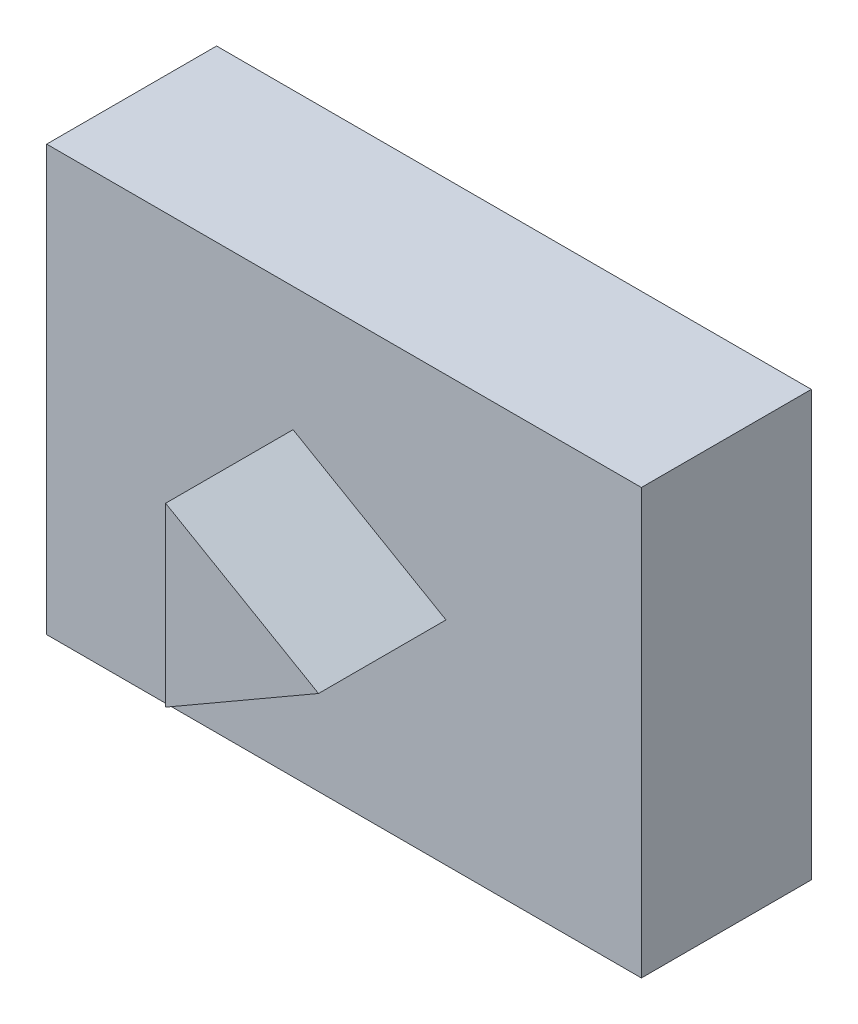
ISO-10303-21;
HEADER;
FILE_DESCRIPTION(('STEP AP214'),'2;1');
FILE_NAME('part.step','',(''),(''),'','','');
FILE_SCHEMA(('AUTOMOTIVE_DESIGN { 1 0 10303 214 1 1 1 1 }'));
ENDSEC;
DATA;
#1=APPLICATION_CONTEXT('core data for automotive mechanical design processes');
#2=APPLICATION_PROTOCOL_DEFINITION('international standard','automotive_design',2000,#1);
#3=PRODUCT_CONTEXT('',#1,'mechanical');
#4=PRODUCT('Part','Part','',(#3));
#5=PRODUCT_RELATED_PRODUCT_CATEGORY('part','',(#4));
#6=PRODUCT_DEFINITION_FORMATION('','',#4);
#7=PRODUCT_DEFINITION_CONTEXT('part definition',#1,'design');
#8=PRODUCT_DEFINITION('design','',#6,#7);
#9=PRODUCT_DEFINITION_SHAPE('','',#8);
#10=(LENGTH_UNIT() NAMED_UNIT(*) SI_UNIT(.MILLI.,.METRE.));
#11=(NAMED_UNIT(*) PLANE_ANGLE_UNIT() SI_UNIT($,.RADIAN.));
#12=(NAMED_UNIT(*) SI_UNIT($,.STERADIAN.) SOLID_ANGLE_UNIT());
#13=UNCERTAINTY_MEASURE_WITH_UNIT(LENGTH_MEASURE(1.E-05),#10,'distance_accuracy_value','');
#14=(GEOMETRIC_REPRESENTATION_CONTEXT(3) GLOBAL_UNCERTAINTY_ASSIGNED_CONTEXT((#13)) GLOBAL_UNIT_ASSIGNED_CONTEXT((#10,
#11,#12)) REPRESENTATION_CONTEXT('',''));
#15=CARTESIAN_POINT('',(0.,0.,0.));
#16=DIRECTION('',(0.,0.,1.));
#17=DIRECTION('',(1.,0.,0.));
#18=AXIS2_PLACEMENT_3D('',#15,#16,#17);
#19=CARTESIAN_POINT('',(35.,25.,10.));
#20=DIRECTION('',(-1.,0.,0.));
#21=DIRECTION('',(0.,-1.,0.));
#22=AXIS2_PLACEMENT_3D('',#19,#20,#21);
#23=PLANE('',#22);
#24=DIRECTION('',(0.,1.,0.));
#25=VECTOR('',#24,1.);
#26=CARTESIAN_POINT('',(35.,25.,-10.));
#27=LINE('',#26,#25);
#28=CARTESIAN_POINT('',(35.,-25.,-10.));
#29=VERTEX_POINT('',#28);
#30=CARTESIAN_POINT('',(35.,25.,-10.));
#31=VERTEX_POINT('',#30);
#32=EDGE_CURVE('E113',#29,#31,#27,.T.);
#33=ORIENTED_EDGE('',*,*,#32,.T.);
#34=DIRECTION('',(0.,0.,-1.));
#35=VECTOR('',#34,1.);
#36=CARTESIAN_POINT('',(35.,25.,10.));
#37=LINE('',#36,#35);
#38=CARTESIAN_POINT('',(35.,25.,10.));
#39=VERTEX_POINT('',#38);
#40=EDGE_CURVE('E11',#39,#31,#37,.T.);
#41=ORIENTED_EDGE('',*,*,#40,.F.);
#42=DIRECTION('',(0.,1.,0.));
#43=VECTOR('',#42,1.);
#44=CARTESIAN_POINT('',(35.,25.,10.));
#45=LINE('',#44,#43);
#46=CARTESIAN_POINT('',(35.,-25.,10.));
#47=VERTEX_POINT('',#46);
#48=EDGE_CURVE('E122',#47,#39,#45,.T.);
#49=ORIENTED_EDGE('',*,*,#48,.F.);
#50=DIRECTION('',(0.,0.,-1.));
#51=VECTOR('',#50,1.);
#52=CARTESIAN_POINT('',(35.,-25.,10.));
#53=LINE('',#52,#51);
#54=EDGE_CURVE('E131',#47,#29,#53,.T.);
#55=ORIENTED_EDGE('',*,*,#54,.T.);
#56=EDGE_LOOP('',(#33,#41,#49,#55));
#57=FACE_BOUND('',#56,.T.);
#58=ADVANCED_FACE('F37',(#57),#23,.F.);
#59=CARTESIAN_POINT('',(-35.,25.,10.));
#60=DIRECTION('',(0.,-1.,0.));
#61=DIRECTION('',(0.,0.,-1.));
#62=AXIS2_PLACEMENT_3D('',#59,#60,#61);
#63=PLANE('',#62);
#64=DIRECTION('',(-1.,0.,0.));
#65=VECTOR('',#64,1.);
#66=CARTESIAN_POINT('',(-35.,25.,-10.));
#67=LINE('',#66,#65);
#68=CARTESIAN_POINT('',(-35.,25.,-10.));
#69=VERTEX_POINT('',#68);
#70=EDGE_CURVE('E116',#31,#69,#67,.T.);
#71=ORIENTED_EDGE('',*,*,#70,.T.);
#72=DIRECTION('',(0.,0.,-1.));
#73=VECTOR('',#72,1.);
#74=CARTESIAN_POINT('',(-35.,25.,10.));
#75=LINE('',#74,#73);
#76=CARTESIAN_POINT('',(-35.,25.,10.));
#77=VERTEX_POINT('',#76);
#78=EDGE_CURVE('E44',#77,#69,#75,.T.);
#79=ORIENTED_EDGE('',*,*,#78,.F.);
#80=DIRECTION('',(-1.,0.,0.));
#81=VECTOR('',#80,1.);
#82=CARTESIAN_POINT('',(-35.,25.,10.));
#83=LINE('',#82,#81);
#84=EDGE_CURVE('E125',#39,#77,#83,.T.);
#85=ORIENTED_EDGE('',*,*,#84,.F.);
#86=ORIENTED_EDGE('',*,*,#40,.T.);
#87=EDGE_LOOP('',(#71,#79,#85,#86));
#88=FACE_BOUND('',#87,.T.);
#89=ADVANCED_FACE('F162',(#88),#63,.F.);
#90=CARTESIAN_POINT('',(-35.,25.,10.));
#91=DIRECTION('',(1.,0.,0.));
#92=DIRECTION('',(0.,1.,0.));
#93=AXIS2_PLACEMENT_3D('',#90,#91,#92);
#94=PLANE('',#93);
#95=DIRECTION('',(0.,-1.,0.));
#96=VECTOR('',#95,1.);
#97=CARTESIAN_POINT('',(-35.,25.,-10.));
#98=LINE('',#97,#96);
#99=CARTESIAN_POINT('',(-35.,-25.,-10.));
#100=VERTEX_POINT('',#99);
#101=EDGE_CURVE('E134',#69,#100,#98,.T.);
#102=ORIENTED_EDGE('',*,*,#101,.T.);
#103=DIRECTION('',(0.,0.,-1.));
#104=VECTOR('',#103,1.);
#105=CARTESIAN_POINT('',(-35.,-25.,10.));
#106=LINE('',#105,#104);
#107=CARTESIAN_POINT('',(-35.,-25.,10.));
#108=VERTEX_POINT('',#107);
#109=EDGE_CURVE('E139',#108,#100,#106,.T.);
#110=ORIENTED_EDGE('',*,*,#109,.F.);
#111=DIRECTION('',(0.,-1.,0.));
#112=VECTOR('',#111,1.);
#113=CARTESIAN_POINT('',(-35.,25.,10.));
#114=LINE('',#113,#112);
#115=EDGE_CURVE('E128',#77,#108,#114,.T.);
#116=ORIENTED_EDGE('',*,*,#115,.F.);
#117=ORIENTED_EDGE('',*,*,#78,.T.);
#118=EDGE_LOOP('',(#102,#110,#116,#117));
#119=FACE_BOUND('',#118,.T.);
#120=ADVANCED_FACE('F146',(#119),#94,.F.);
#121=CARTESIAN_POINT('',(-35.,-25.,10.));
#122=DIRECTION('',(0.,1.,0.));
#123=DIRECTION('',(0.,0.,1.));
#124=AXIS2_PLACEMENT_3D('',#121,#122,#123);
#125=PLANE('',#124);
#126=DIRECTION('',(1.,0.,0.));
#127=VECTOR('',#126,1.);
#128=CARTESIAN_POINT('',(-35.,-25.,-10.));
#129=LINE('',#128,#127);
#130=EDGE_CURVE('E126',#100,#29,#129,.T.);
#131=ORIENTED_EDGE('',*,*,#130,.T.);
#132=ORIENTED_EDGE('',*,*,#54,.F.);
#133=DIRECTION('',(1.,0.,0.));
#134=VECTOR('',#133,1.);
#135=CARTESIAN_POINT('',(-35.,-25.,10.));
#136=LINE('',#135,#134);
#137=EDGE_CURVE('E130',#108,#47,#136,.T.);
#138=ORIENTED_EDGE('',*,*,#137,.F.);
#139=ORIENTED_EDGE('',*,*,#109,.T.);
#140=EDGE_LOOP('',(#131,#132,#138,#139));
#141=FACE_BOUND('',#140,.T.);
#142=ADVANCED_FACE('F155',(#141),#125,.F.);
#143=CARTESIAN_POINT('',(0.,0.,10.));
#144=DIRECTION('',(0.,0.,1.));
#145=DIRECTION('',(1.,0.,0.));
#146=AXIS2_PLACEMENT_3D('',#143,#144,#145);
#147=PLANE('',#146);
#148=DIRECTION('',(0.866025403784439,0.5,0.));
#149=VECTOR('',#148,1.);
#150=CARTESIAN_POINT('',(-6.00000000000003,-10.3923048454133,10.));
#151=LINE('',#150,#149);
#152=CARTESIAN_POINT('',(-6.00000000000003,-10.3923048454133,10.));
#153=VERTEX_POINT('',#152);
#154=CARTESIAN_POINT('',(12.0000000000001,0.,10.));
#155=VERTEX_POINT('',#154);
#156=EDGE_CURVE('E51',#153,#155,#151,.T.);
#157=ORIENTED_EDGE('',*,*,#156,.F.);
#158=DIRECTION('',(0.,-1.,0.));
#159=VECTOR('',#158,1.);
#160=CARTESIAN_POINT('',(-6.00000000000002,10.3923048454133,10.));
#161=LINE('',#160,#159);
#162=CARTESIAN_POINT('',(-6.00000000000002,10.3923048454133,10.));
#163=VERTEX_POINT('',#162);
#164=EDGE_CURVE('E110',#163,#153,#161,.T.);
#165=ORIENTED_EDGE('',*,*,#164,.F.);
#166=DIRECTION('',(-0.866025403784439,0.5,0.));
#167=VECTOR('',#166,1.);
#168=CARTESIAN_POINT('',(12.0000000000001,0.,10.));
#169=LINE('',#168,#167);
#170=EDGE_CURVE('E55',#155,#163,#169,.T.);
#171=ORIENTED_EDGE('',*,*,#170,.F.);
#172=EDGE_LOOP('',(#157,#165,#171));
#173=FACE_BOUND('',#172,.T.);
#174=ORIENTED_EDGE('',*,*,#48,.T.);
#175=ORIENTED_EDGE('',*,*,#84,.T.);
#176=ORIENTED_EDGE('',*,*,#115,.T.);
#177=ORIENTED_EDGE('',*,*,#137,.T.);
#178=EDGE_LOOP('',(#174,#175,#176,#177));
#179=FACE_BOUND('',#178,.T.);
#180=ADVANCED_FACE('F161',(#173,#179),#147,.T.);
#181=CARTESIAN_POINT('',(0.,0.,-10.));
#182=DIRECTION('',(0.,0.,1.));
#183=DIRECTION('',(1.,0.,0.));
#184=AXIS2_PLACEMENT_3D('',#181,#182,#183);
#185=PLANE('',#184);
#186=ORIENTED_EDGE('',*,*,#32,.F.);
#187=ORIENTED_EDGE('',*,*,#130,.F.);
#188=ORIENTED_EDGE('',*,*,#101,.F.);
#189=ORIENTED_EDGE('',*,*,#70,.F.);
#190=EDGE_LOOP('',(#186,#187,#188,#189));
#191=FACE_BOUND('',#190,.T.);
#192=ADVANCED_FACE('F152',(#191),#185,.F.);
#193=CARTESIAN_POINT('',(-6.00000000000003,-10.3923048454133,25.));
#194=DIRECTION('',(-0.5,0.866025403784439,0.));
#195=DIRECTION('',(-0.866025403784439,-0.5,0.));
#196=AXIS2_PLACEMENT_3D('',#193,#194,#195);
#197=PLANE('',#196);
#198=ORIENTED_EDGE('',*,*,#156,.T.);
#199=DIRECTION('',(0.,0.,-1.));
#200=VECTOR('',#199,1.);
#201=CARTESIAN_POINT('',(12.0000000000001,0.,25.));
#202=LINE('',#201,#200);
#203=CARTESIAN_POINT('',(12.0000000000001,0.,25.));
#204=VERTEX_POINT('',#203);
#205=EDGE_CURVE('E97',#204,#155,#202,.T.);
#206=ORIENTED_EDGE('',*,*,#205,.F.);
#207=DIRECTION('',(0.866025403784439,0.5,0.));
#208=VECTOR('',#207,1.);
#209=CARTESIAN_POINT('',(-6.00000000000003,-10.3923048454133,25.));
#210=LINE('',#209,#208);
#211=CARTESIAN_POINT('',(-6.00000000000003,-10.3923048454133,25.));
#212=VERTEX_POINT('',#211);
#213=EDGE_CURVE('E103',#212,#204,#210,.T.);
#214=ORIENTED_EDGE('',*,*,#213,.F.);
#215=DIRECTION('',(0.,0.,-1.));
#216=VECTOR('',#215,1.);
#217=CARTESIAN_POINT('',(-6.00000000000003,-10.3923048454133,25.));
#218=LINE('',#217,#216);
#219=EDGE_CURVE('E118',#212,#153,#218,.T.);
#220=ORIENTED_EDGE('',*,*,#219,.T.);
#221=EDGE_LOOP('',(#198,#206,#214,#220));
#222=FACE_BOUND('',#221,.T.);
#223=ADVANCED_FACE('F112',(#222),#197,.F.);
#224=CARTESIAN_POINT('',(12.0000000000001,0.,25.));
#225=DIRECTION('',(-0.5,-0.866025403784439,0.));
#226=DIRECTION('',(0.866025403784439,-0.5,0.));
#227=AXIS2_PLACEMENT_3D('',#224,#225,#226);
#228=PLANE('',#227);
#229=ORIENTED_EDGE('',*,*,#170,.T.);
#230=DIRECTION('',(0.,0.,-1.));
#231=VECTOR('',#230,1.);
#232=CARTESIAN_POINT('',(-6.00000000000002,10.3923048454133,25.));
#233=LINE('',#232,#231);
#234=CARTESIAN_POINT('',(-6.00000000000002,10.3923048454133,25.));
#235=VERTEX_POINT('',#234);
#236=EDGE_CURVE('E99',#235,#163,#233,.T.);
#237=ORIENTED_EDGE('',*,*,#236,.F.);
#238=DIRECTION('',(-0.866025403784439,0.5,0.));
#239=VECTOR('',#238,1.);
#240=CARTESIAN_POINT('',(12.0000000000001,0.,25.));
#241=LINE('',#240,#239);
#242=EDGE_CURVE('E93',#204,#235,#241,.T.);
#243=ORIENTED_EDGE('',*,*,#242,.F.);
#244=ORIENTED_EDGE('',*,*,#205,.T.);
#245=EDGE_LOOP('',(#229,#237,#243,#244));
#246=FACE_BOUND('',#245,.T.);
#247=ADVANCED_FACE('F95',(#246),#228,.F.);
#248=CARTESIAN_POINT('',(-6.00000000000002,10.3923048454133,25.));
#249=DIRECTION('',(1.,0.,0.));
#250=DIRECTION('',(0.,1.,0.));
#251=AXIS2_PLACEMENT_3D('',#248,#249,#250);
#252=PLANE('',#251);
#253=ORIENTED_EDGE('',*,*,#164,.T.);
#254=ORIENTED_EDGE('',*,*,#219,.F.);
#255=DIRECTION('',(0.,-1.,0.));
#256=VECTOR('',#255,1.);
#257=CARTESIAN_POINT('',(-6.00000000000002,10.3923048454133,25.));
#258=LINE('',#257,#256);
#259=EDGE_CURVE('E102',#235,#212,#258,.T.);
#260=ORIENTED_EDGE('',*,*,#259,.F.);
#261=ORIENTED_EDGE('',*,*,#236,.T.);
#262=EDGE_LOOP('',(#253,#254,#260,#261));
#263=FACE_BOUND('',#262,.T.);
#264=ADVANCED_FACE('F180',(#263),#252,.F.);
#265=CARTESIAN_POINT('',(0.,0.,25.));
#266=DIRECTION('',(0.,0.,1.));
#267=DIRECTION('',(1.,0.,0.));
#268=AXIS2_PLACEMENT_3D('',#265,#266,#267);
#269=PLANE('',#268);
#270=ORIENTED_EDGE('',*,*,#213,.T.);
#271=ORIENTED_EDGE('',*,*,#242,.T.);
#272=ORIENTED_EDGE('',*,*,#259,.T.);
#273=EDGE_LOOP('',(#270,#271,#272));
#274=FACE_BOUND('',#273,.T.);
#275=ADVANCED_FACE('F106',(#274),#269,.T.);
#276=CLOSED_SHELL('',(#58,#89,#120,#142,#180,#192,#223,#247,#264,#275));
#277=MANIFOLD_SOLID_BREP('B2',#276);
#278=ADVANCED_BREP_SHAPE_REPRESENTATION('',(#18,#277),#14);
#279=SHAPE_DEFINITION_REPRESENTATION(#9,#278);
ENDSEC;
END-ISO-10303-21;
